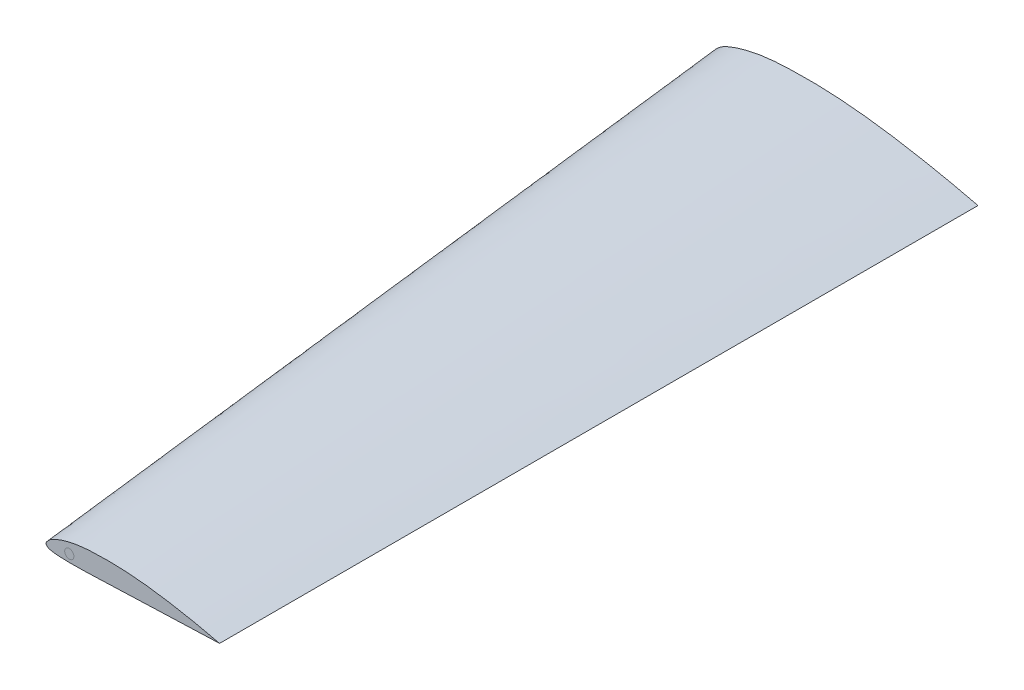
ISO-10303-21;
HEADER;
FILE_DESCRIPTION(('STEP AP214'),'2;1');
FILE_NAME('part.step','',(''),(''),'','','');
FILE_SCHEMA(('AUTOMOTIVE_DESIGN { 1 0 10303 214 1 1 1 1 }'));
ENDSEC;
DATA;
#1=APPLICATION_CONTEXT('core data for automotive mechanical design processes');
#2=APPLICATION_PROTOCOL_DEFINITION('international standard','automotive_design',2000,#1);
#3=PRODUCT_CONTEXT('',#1,'mechanical');
#4=PRODUCT('Part','Part','',(#3));
#5=PRODUCT_RELATED_PRODUCT_CATEGORY('part','',(#4));
#6=PRODUCT_DEFINITION_FORMATION('','',#4);
#7=PRODUCT_DEFINITION_CONTEXT('part definition',#1,'design');
#8=PRODUCT_DEFINITION('design','',#6,#7);
#9=PRODUCT_DEFINITION_SHAPE('','',#8);
#10=(LENGTH_UNIT() NAMED_UNIT(*) SI_UNIT(.MILLI.,.METRE.));
#11=(NAMED_UNIT(*) PLANE_ANGLE_UNIT() SI_UNIT($,.RADIAN.));
#12=(NAMED_UNIT(*) SI_UNIT($,.STERADIAN.) SOLID_ANGLE_UNIT());
#13=UNCERTAINTY_MEASURE_WITH_UNIT(LENGTH_MEASURE(1.E-05),#10,'distance_accuracy_value','');
#14=(GEOMETRIC_REPRESENTATION_CONTEXT(3) GLOBAL_UNCERTAINTY_ASSIGNED_CONTEXT((#13)) GLOBAL_UNIT_ASSIGNED_CONTEXT((#10,
#11,#12)) REPRESENTATION_CONTEXT('',''));
#15=CARTESIAN_POINT('',(0.,0.,0.));
#16=DIRECTION('',(0.,0.,1.));
#17=DIRECTION('',(1.,0.,0.));
#18=AXIS2_PLACEMENT_3D('',#15,#16,#17);
#19=CARTESIAN_POINT('',(10.1,0.999999999999999,0.));
#20=DIRECTION('',(0.,0.,-1.));
#21=DIRECTION('',(-1.,0.,0.));
#22=AXIS2_PLACEMENT_3D('',#19,#20,#21);
#23=PLANE('',#22);
#24=CARTESIAN_POINT('',(10.1,0.999999999999999,0.));
#25=DIRECTION('',(0.,0.,-1.));
#26=DIRECTION('',(-1.,0.,0.));
#27=AXIS2_PLACEMENT_3D('',#24,#25,#26);
#28=CIRCLE('',#27,2.);
#29=CARTESIAN_POINT('',(8.1,0.999999999999999,0.));
#30=VERTEX_POINT('',#29);
#31=EDGE_CURVE('E101',#30,#30,#28,.T.);
#32=ORIENTED_EDGE('',*,*,#31,.T.);
#33=EDGE_LOOP('',(#32));
#34=FACE_BOUND('',#33,.T.);
#35=ADVANCED_FACE('F95',(#34),#23,.T.);
#36=CARTESIAN_POINT('',(49.7,0.999999999999999,329.));
#37=DIRECTION('',(0.,0.,-1.));
#38=DIRECTION('',(-1.,0.,0.));
#39=AXIS2_PLACEMENT_3D('',#36,#37,#38);
#40=PLANE('',#39);
#41=CARTESIAN_POINT('',(49.7,0.999999999999999,329.));
#42=DIRECTION('',(0.,0.,-1.));
#43=DIRECTION('',(-1.,0.,0.));
#44=AXIS2_PLACEMENT_3D('',#41,#42,#43);
#45=CIRCLE('',#44,2.);
#46=CARTESIAN_POINT('',(47.7,0.999999999999999,329.));
#47=VERTEX_POINT('',#46);
#48=EDGE_CURVE('E12',#47,#47,#45,.T.);
#49=ORIENTED_EDGE('',*,*,#48,.F.);
#50=EDGE_LOOP('',(#49));
#51=FACE_BOUND('',#50,.T.);
#52=ADVANCED_FACE('F110',(#51),#40,.F.);
#53=CARTESIAN_POINT('',(8.1,0.999999999999999,0.));
#54=CARTESIAN_POINT('',(47.7,0.999999999999999,329.));
#55=CARTESIAN_POINT('',(8.1,5.,0.));
#56=CARTESIAN_POINT('',(47.7,5.,329.));
#57=CARTESIAN_POINT('',(12.1,5.,0.));
#58=CARTESIAN_POINT('',(51.7,5.,329.));
#59=CARTESIAN_POINT('',(12.1,0.999999999999999,0.));
#60=CARTESIAN_POINT('',(51.7,0.999999999999999,329.));
#61=CARTESIAN_POINT('',(12.1,-3.,0.));
#62=CARTESIAN_POINT('',(51.7,-3.,329.));
#63=CARTESIAN_POINT('',(8.1,-3.,0.));
#64=CARTESIAN_POINT('',(47.7,-3.,329.));
#65=CARTESIAN_POINT('',(8.1,0.999999999999999,0.));
#66=CARTESIAN_POINT('',(47.7,0.999999999999999,329.));
#67=(BOUNDED_SURFACE() B_SPLINE_SURFACE(3,1,((#53,#54),(#55,#56),(#57,#58),(#59,#60),(#61,#62),
(#63,#64),(#65,#66)),.UNSPECIFIED.,.T.,.F.,.F.) B_SPLINE_SURFACE_WITH_KNOTS((4,3,4),(2,2),(0.,
0.5,1.),(0.,1.),.UNSPECIFIED.) GEOMETRIC_REPRESENTATION_ITEM() RATIONAL_B_SPLINE_SURFACE(((1.,
1.),(0.333333333333333,0.333333333333333),(0.333333333333333,0.333333333333333),(1.,1.),
(0.333333333333333,0.333333333333333),(0.333333333333333,0.333333333333333),(1.,1.))) REPRESENTATION_ITEM('') SURFACE());
#68=CARTESIAN_POINT('',(47.7,0.999999999999999,329.));
#69=CARTESIAN_POINT('',(47.2875,0.999999999999999,325.572916666667));
#70=CARTESIAN_POINT('',(46.875,0.999999999999999,322.145833333333));
#71=CARTESIAN_POINT('',(46.05,0.999999999999999,315.291666666667));
#72=CARTESIAN_POINT('',(45.6375,0.999999999999999,311.864583333333));
#73=CARTESIAN_POINT('',(44.8125,0.999999999999999,305.010416666667));
#74=CARTESIAN_POINT('',(44.4,0.999999999999999,301.583333333333));
#75=CARTESIAN_POINT('',(43.575,0.999999999999999,294.729166666667));
#76=CARTESIAN_POINT('',(43.1625,0.999999999999999,291.302083333333));
#77=CARTESIAN_POINT('',(42.3375,0.999999999999999,284.447916666667));
#78=CARTESIAN_POINT('',(41.925,0.999999999999999,281.020833333333));
#79=CARTESIAN_POINT('',(41.1,0.999999999999999,274.166666666667));
#80=CARTESIAN_POINT('',(40.6875,0.999999999999999,270.739583333333));
#81=CARTESIAN_POINT('',(39.8625,0.999999999999999,263.885416666667));
#82=CARTESIAN_POINT('',(39.45,0.999999999999999,260.458333333333));
#83=CARTESIAN_POINT('',(38.625,0.999999999999999,253.604166666667));
#84=CARTESIAN_POINT('',(38.2125,0.999999999999999,250.177083333333));
#85=CARTESIAN_POINT('',(37.3875,0.999999999999999,243.322916666667));
#86=CARTESIAN_POINT('',(36.975,0.999999999999999,239.895833333333));
#87=CARTESIAN_POINT('',(36.15,0.999999999999999,233.041666666667));
#88=CARTESIAN_POINT('',(35.7375,0.999999999999999,229.614583333333));
#89=CARTESIAN_POINT('',(34.9125,0.999999999999999,222.760416666667));
#90=CARTESIAN_POINT('',(34.5,0.999999999999999,219.333333333333));
#91=CARTESIAN_POINT('',(33.675,0.999999999999999,212.479166666667));
#92=CARTESIAN_POINT('',(33.2625,0.999999999999999,209.052083333333));
#93=CARTESIAN_POINT('',(32.4375,0.999999999999999,202.197916666667));
#94=CARTESIAN_POINT('',(32.025,0.999999999999999,198.770833333333));
#95=CARTESIAN_POINT('',(31.2,0.999999999999999,191.916666666667));
#96=CARTESIAN_POINT('',(30.7875,0.999999999999999,188.489583333333));
#97=CARTESIAN_POINT('',(29.9625,0.999999999999999,181.635416666667));
#98=CARTESIAN_POINT('',(29.55,0.999999999999999,178.208333333333));
#99=CARTESIAN_POINT('',(28.725,0.999999999999999,171.354166666667));
#100=CARTESIAN_POINT('',(28.3125,0.999999999999999,167.927083333333));
#101=CARTESIAN_POINT('',(27.4875,0.999999999999999,161.072916666667));
#102=CARTESIAN_POINT('',(27.075,0.999999999999999,157.645833333333));
#103=CARTESIAN_POINT('',(26.25,0.999999999999999,150.791666666667));
#104=CARTESIAN_POINT('',(25.8375,0.999999999999999,147.364583333333));
#105=CARTESIAN_POINT('',(25.0125,0.999999999999999,140.510416666667));
#106=CARTESIAN_POINT('',(24.6,0.999999999999999,137.083333333333));
#107=CARTESIAN_POINT('',(23.775,0.999999999999999,130.229166666667));
#108=CARTESIAN_POINT('',(23.3625,0.999999999999999,126.802083333333));
#109=CARTESIAN_POINT('',(22.5375,0.999999999999999,119.947916666667));
#110=CARTESIAN_POINT('',(22.125,0.999999999999999,116.520833333333));
#111=CARTESIAN_POINT('',(21.3,0.999999999999999,109.666666666667));
#112=CARTESIAN_POINT('',(20.8875,0.999999999999999,106.239583333333));
#113=CARTESIAN_POINT('',(20.0625,0.999999999999999,99.3854166666667));
#114=CARTESIAN_POINT('',(19.65,0.999999999999999,95.9583333333334));
#115=CARTESIAN_POINT('',(18.825,0.999999999999999,89.1041666666667));
#116=CARTESIAN_POINT('',(18.4125,0.999999999999999,85.6770833333333));
#117=CARTESIAN_POINT('',(17.5875,0.999999999999999,78.8229166666667));
#118=CARTESIAN_POINT('',(17.175,0.999999999999999,75.3958333333333));
#119=CARTESIAN_POINT('',(16.35,0.999999999999999,68.5416666666667));
#120=CARTESIAN_POINT('',(15.9375,0.999999999999999,65.1145833333334));
#121=CARTESIAN_POINT('',(15.1125,0.999999999999999,58.2604166666667));
#122=CARTESIAN_POINT('',(14.7,0.999999999999999,54.8333333333333));
#123=CARTESIAN_POINT('',(13.875,0.999999999999999,47.9791666666667));
#124=CARTESIAN_POINT('',(13.4625,0.999999999999999,44.5520833333333));
#125=CARTESIAN_POINT('',(12.6375,0.999999999999999,37.6979166666667));
#126=CARTESIAN_POINT('',(12.225,0.999999999999999,34.2708333333333));
#127=CARTESIAN_POINT('',(11.4,0.999999999999999,27.4166666666667));
#128=CARTESIAN_POINT('',(10.9875,0.999999999999999,23.9895833333333));
#129=CARTESIAN_POINT('',(10.1625,0.999999999999999,17.1354166666667));
#130=CARTESIAN_POINT('',(9.75,0.999999999999999,13.7083333333333));
#131=CARTESIAN_POINT('',(8.925,0.999999999999999,6.85416666666667));
#132=CARTESIAN_POINT('',(8.5125,0.999999999999999,3.42708333333334));
#133=CARTESIAN_POINT('',(8.1,0.999999999999999,0.));
#134=B_SPLINE_CURVE_WITH_KNOTS('',3,(#68,#69,#70,#71,#72,#73,#74,#75,#76,#77,#78,#79,#80,#81,
#82,#83,#84,#85,#86,#87,#88,#89,#90,#91,#92,#93,#94,#95,#96,#97,#98,#99,#100,#101,#102,#103,
#104,#105,#106,#107,#108,#109,#110,#111,#112,#113,#114,#115,#116,#117,#118,#119,#120,#121,#122,
#123,#124,#125,#126,#127,#128,#129,#130,#131,#132,#133),.UNSPECIFIED.,.F.,.F.,(4,2,2,2,2,2,2,2,
2,2,2,2,2,2,2,2,2,2,2,2,2,2,2,2,2,2,2,2,2,2,2,2,4),(0.,10.3554578755601,20.7109157511202,
31.0663736266803,41.4218315022405,51.7772893778006,62.1327472533607,72.4882051289208,
82.8436630044809,93.1991208800411,103.554578755601,113.910036631161,124.265494506721,
134.620952382282,144.976410257842,155.331868133402,165.687326008962,176.042783884522,
186.398241760082,196.753699635642,207.109157511202,217.464615386762,227.820073262323,
238.175531137883,248.530989013443,258.886446889003,269.241904764563,279.597362640123,
289.952820515683,300.308278391243,310.663736266804,321.019194142364,331.374652017924),.UNSPECIFIED.);
#135=EDGE_CURVE('BSEAM108',#47,#30,#134,.T.);
#136=ORIENTED_EDGE('',*,*,#48,.T.);
#137=ORIENTED_EDGE('',*,*,#31,.F.);
#138=ORIENTED_EDGE('',*,*,#135,.T.);
#139=ORIENTED_EDGE('',*,*,#135,.F.);
#140=EDGE_LOOP('',(#136,#138,#137,#139));
#141=FACE_BOUND('',#140,.T.);
#142=ADVANCED_FACE('F108',(#141),#67,.F.);
#143=CLOSED_SHELL('',(#35,#52,#142));
#144=MANIFOLD_SOLID_BREP('B2',#143);
#145=CARTESIAN_POINT('',(114.900829426016,-0.0501642102156497,329.));
#146=DIRECTION('',(0.03670589649599,-0.99932611151837,0.));
#147=DIRECTION('',(-0.99932611151837,-0.03670589649599,0.));
#148=AXIS2_PLACEMENT_3D('',#145,#146,#147);
#149=PLANE('',#148);
#150=DIRECTION('',(-0.99932611151837,-0.03670589649599,0.));
#151=VECTOR('',#150,1.);
#152=CARTESIAN_POINT('',(114.736719522713,-0.056192073447858,329.));
#153=LINE('',#152,#151);
#154=CARTESIAN_POINT('',(114.900829426016,-0.0501642102156497,329.));
#155=VERTEX_POINT('',#154);
#156=CARTESIAN_POINT('',(114.57260961941,-0.0622199366800662,329.));
#157=VERTEX_POINT('',#156);
#158=EDGE_CURVE('E93',#155,#157,#153,.T.);
#159=ORIENTED_EDGE('',*,*,#158,.T.);
#160=DIRECTION('',(-0.00052464922681561,-1.92707065233546E-05,-0.999999862185905));
#161=VECTOR('',#160,1.);
#162=CARTESIAN_POINT('',(114.486304809705,-0.0653899683400331,164.5));
#163=LINE('',#162,#161);
#164=CARTESIAN_POINT('',(114.4,-0.06856,0.));
#165=VERTEX_POINT('',#164);
#166=EDGE_CURVE('E161',#157,#165,#163,.T.);
#167=ORIENTED_EDGE('',*,*,#166,.T.);
#168=DIRECTION('',(-0.99932611151837,-0.0367058964959925,0.));
#169=VECTOR('',#168,1.);
#170=CARTESIAN_POINT('',(114.650414713008,-0.0593621051078248,0.));
#171=LINE('',#170,#169);
#172=CARTESIAN_POINT('',(114.900829426016,-0.0501642102156497,0.));
#173=VERTEX_POINT('',#172);
#174=EDGE_CURVE('E210',#173,#165,#171,.T.);
#175=ORIENTED_EDGE('',*,*,#174,.F.);
#176=DIRECTION('',(0.,0.,-1.));
#177=VECTOR('',#176,1.);
#178=CARTESIAN_POINT('',(114.900829426016,-0.0501642102156497,164.5));
#179=LINE('',#178,#177);
#180=EDGE_CURVE('E191',#155,#173,#179,.T.);
#181=ORIENTED_EDGE('',*,*,#180,.F.);
#182=EDGE_LOOP('',(#159,#167,#175,#181));
#183=FACE_BOUND('',#182,.T.);
#184=ADVANCED_FACE('F149',(#183),#149,.T.);
#185=CARTESIAN_POINT('',(114.57260961941,-0.0622199366800662,329.));
#186=CARTESIAN_POINT('',(114.4,-0.06856,0.));
#187=CARTESIAN_POINT('',(112.977295975491,-0.120816841951953,329.));
#188=CARTESIAN_POINT('',(111.965716629161,-0.157972807713173,0.));
#189=CARTESIAN_POINT('',(109.786644863781,-0.237979796076084,329.));
#190=CARTESIAN_POINT('',(107.097110694278,-0.336751805766281,0.));
#191=CARTESIAN_POINT('',(105.000693099298,-0.413750156151413,329.000000000001));
#192=CARTESIAN_POINT('',(99.7942412380696,-0.604959601121479,0.));
#193=CARTESIAN_POINT('',(100.214728756306,-0.589510986458513,329.));
#194=CARTESIAN_POINT('',(92.4913536383134,-0.8731494297109,0.));
#195=CARTESIAN_POINT('',(96.2264313571632,-0.735983254405373,329.));
#196=CARTESIAN_POINT('',(86.4056226452766,-1.09665710687671,0.));
#197=CARTESIAN_POINT('',(93.0357910844883,-0.85316110543344,329.));
#198=CARTESIAN_POINT('',(81.5370332937189,-1.27545083091915,0.));
#199=CARTESIAN_POINT('',(90.6428111354104,-0.941052950988877,329.));
#200=CARTESIAN_POINT('',(77.885594217603,-1.40956958634636,0.));
#201=CARTESIAN_POINT('',(88.2498328738692,-1.0289616927778,329.));
#202=CARTESIAN_POINT('',(74.2341544850718,-1.5437082159473,0.));
#203=CARTESIAN_POINT('',(85.856852391205,-1.11683664511502,329.));
#204=CARTESIAN_POINT('',(70.5827135432517,-1.67779370490371,0.));
#205=CARTESIAN_POINT('',(83.4638704721177,-1.2046573139067,329.));
#206=CARTESIAN_POINT('',(66.9312695396541,-1.81180573537152,0.));
#207=CARTESIAN_POINT('',(81.0708879975479,-1.29247078457698,329.));
#208=CARTESIAN_POINT('',(63.2798246772732,-1.94578905588669,0.));
#209=CARTESIAN_POINT('',(78.6779074851115,-1.38033351483244,329.));
#210=CARTESIAN_POINT('',(59.6283831410075,-2.07986597687277,0.));
#211=CARTESIAN_POINT('',(76.284934331329,-1.46839890937835,329.));
#212=CARTESIAN_POINT('',(55.9769530860873,-2.21425367726004,0.));
#213=CARTESIAN_POINT('',(73.8919664634316,-1.55660594759836,329.000000000001));
#214=CARTESIAN_POINT('',(52.3255302758724,-2.34883859679651,0.));
#215=CARTESIAN_POINT('',(71.4989899683453,-1.64458072330846,328.999999999999));
#216=CARTESIAN_POINT('',(48.6740949273067,-2.48308328284724,0.));
#217=CARTESIAN_POINT('',(69.105989839964,-1.73190836915481,329.000000000001));
#218=CARTESIAN_POINT('',(45.022623273531,-2.61633760751869,0.));
#219=CARTESIAN_POINT('',(66.7129651493619,-1.81856384168044,328.999999999999));
#220=CARTESIAN_POINT('',(41.3711135439631,-2.74854338410483,0.));
#221=CARTESIAN_POINT('',(64.3199669373025,-1.90594191039954,329.000000000001));
#222=CARTESIAN_POINT('',(37.7196460479609,-2.88191417837728,0.));
#223=CARTESIAN_POINT('',(62.3258668299447,-1.98053661442866,329.));
#224=CARTESIAN_POINT('',(34.6768527696352,-2.99567203272385,0.));
#225=CARTESIAN_POINT('',(60.7306395653596,-2.04158861078398,329.));
#226=CARTESIAN_POINT('',(32.2427036249245,-3.08892865656621,0.));
#227=CARTESIAN_POINT('',(59.5341984389728,-2.0868333620039,329.));
#228=CARTESIAN_POINT('',(30.4170537095853,-3.15787478213016,0.));
#229=CARTESIAN_POINT('',(58.3376895460393,-2.13030150456465,329.));
#230=CARTESIAN_POINT('',(28.5913075746204,-3.22423675912527,0.));
#231=CARTESIAN_POINT('',(57.1410810890218,-2.17088745999478,329.));
#232=CARTESIAN_POINT('',(26.7654048989622,-3.2861862573127,0.));
#233=CARTESIAN_POINT('',(55.9443412703829,-2.20748564982281,329.));
#234=CARTESIAN_POINT('',(24.9393037637721,-3.3420032780021,0.));
#235=CARTESIAN_POINT('',(54.7474529311727,-2.23888966087624,329.));
#236=CARTESIAN_POINT('',(23.1129754350255,-3.38993650770668,0.));
#237=CARTESIAN_POINT('',(53.5504153162138,-2.26397201099151,329.));
#238=CARTESIAN_POINT('',(21.2864190315302,-3.42820995119329,0.));
#239=CARTESIAN_POINT('',(52.353232928687,-2.28124339291768,328.999999999999));
#240=CARTESIAN_POINT('',(19.4596429108321,-3.4545494980358,0.));
#241=CARTESIAN_POINT('',(51.15595355233,-2.288861920351,329.000000000001));
#242=CARTESIAN_POINT('',(17.6327163554305,-3.46619351578578,0.));
#243=CARTESIAN_POINT('',(49.9586406141466,-2.28571853254573,329.));
#244=CARTESIAN_POINT('',(15.8057424311789,-3.46135030596471,0.));
#245=CARTESIAN_POINT('',(48.7614456222737,-2.26913668236569,328.999999999999));
#246=CARTESIAN_POINT('',(13.9789412855685,-3.43617298193985,0.));
#247=CARTESIAN_POINT('',(47.5644880850567,-2.23954580418405,329.000000000001));
#248=CARTESIAN_POINT('',(12.1525159866253,-3.39081697985119,0.));
#249=CARTESIAN_POINT('',(46.3681294391765,-2.19096327836138,328.999999999999));
#250=CARTESIAN_POINT('',(10.3269829850202,-3.31692842661875,0.));
#251=CARTESIAN_POINT('',(45.1723870805993,-2.13077185247814,329.000000000001));
#252=CARTESIAN_POINT('',(8.50241829521622,-3.22500915813475,0.));
#253=CARTESIAN_POINT('',(44.1766473883666,-2.06485136570954,328.999999999999));
#254=CARTESIAN_POINT('',(6.98300428865084,-3.12433212750466,0.));
#255=CARTESIAN_POINT('',(43.3830893437349,-1.97750102636705,329.000000000001));
#256=CARTESIAN_POINT('',(5.77213418222719,-2.99109577573727,0.));
#257=CARTESIAN_POINT('',(42.7903884171788,-1.89255413261195,328.999999999999));
#258=CARTESIAN_POINT('',(4.86771256745936,-2.86147635484054,0.));
#259=CARTESIAN_POINT('',(42.2018621119385,-1.78259761794642,329.000000000001));
#260=CARTESIAN_POINT('',(3.96972156813326,-2.69356724495905,0.));
#261=CARTESIAN_POINT('',(41.6144368512239,-1.66711733291326,328.999999999999));
#262=CARTESIAN_POINT('',(3.07329938019767,-2.5176539368822,0.));
#263=CARTESIAN_POINT('',(41.030721908302,-1.53296410466494,329.000000000001));
#264=CARTESIAN_POINT('',(2.18268391666198,-2.3127837560272,0.));
#265=CARTESIAN_POINT('',(40.5658570608416,-1.34296250191487,328.999999999999));
#266=CARTESIAN_POINT('',(1.47329929331152,-2.02281116106069,0.));
#267=CARTESIAN_POINT('',(40.2328838259331,-1.12111197664618,329.));
#268=CARTESIAN_POINT('',(0.965300946177489,-1.68427874419331,0.));
#269=CARTESIAN_POINT('',(40.0045523416234,-0.926760940944612,329.));
#270=CARTESIAN_POINT('',(0.616853662639164,-1.38773413128347,0.));
#271=CARTESIAN_POINT('',(39.8058884927858,-0.701609182245043,329.));
#272=CARTESIAN_POINT('',(0.313781760209367,-1.04410645837054,0.));
#273=CARTESIAN_POINT('',(39.6506080929225,-0.443706027629307,329.));
#274=CARTESIAN_POINT('',(0.0769541024066916,-0.650538017604325,0.));
#275=CARTESIAN_POINT('',(39.5764905355394,-0.148134503442184,329.));
#276=CARTESIAN_POINT('',(-0.0364245156961572,-0.199715317390292,0.));
#277=CARTESIAN_POINT('',(39.6212379263324,0.152906641389699,329.));
#278=CARTESIAN_POINT('',(0.0320651688817571,0.259740207343021,0.));
#279=CARTESIAN_POINT('',(39.7462731745835,0.426434812966566,329.));
#280=CARTESIAN_POINT('',(0.222717607662432,0.677061995084372,0.));
#281=CARTESIAN_POINT('',(39.9118284437912,0.676489937329452,329.));
#282=CARTESIAN_POINT('',(0.475409900417133,1.05859895915268,0.));
#283=CARTESIAN_POINT('',(40.1020297991035,0.907946183502351,329.));
#284=CARTESIAN_POINT('',(0.765550841982641,1.41183330248373,0.));
#285=CARTESIAN_POINT('',(40.3058904903587,1.12719115072782,329.));
#286=CARTESIAN_POINT('',(1.07673483260303,1.74628416301866,0.));
#287=CARTESIAN_POINT('',(40.5170780992003,1.33935694664796,329.));
#288=CARTESIAN_POINT('',(1.39880128657276,2.07019260086103,0.));
#289=CARTESIAN_POINT('',(40.7305626383487,1.54914088404984,329.));
#290=CARTESIAN_POINT('',(1.72484435432684,2.39003706317112,0.));
#291=CARTESIAN_POINT('',(40.9491748450726,1.75369770525246,329.));
#292=CARTESIAN_POINT('',(2.05806352461083,2.70249872806248,0.));
#293=CARTESIAN_POINT('',(41.2491898335489,2.01693149821586,329.));
#294=CARTESIAN_POINT('',(2.51618795565956,3.10386363754482,0.));
#295=CARTESIAN_POINT('',(41.6433845733717,2.32338414751801,329.));
#296=CARTESIAN_POINT('',(3.11744388388253,3.57170414689077,0.));
#297=CARTESIAN_POINT('',(42.1419159584038,2.65541038243405,329.));
#298=CARTESIAN_POINT('',(3.87827233736804,4.07822471273745,0.));
#299=CARTESIAN_POINT('',(42.6603325762503,2.95527445622198,329.));
#300=CARTESIAN_POINT('',(4.66927623600314,4.53582075141618,0.));
#301=CARTESIAN_POINT('',(43.1920051006209,3.23067304723329,329.));
#302=CARTESIAN_POINT('',(5.48057328365004,4.95603831197717,0.));
#303=CARTESIAN_POINT('',(43.73461712113,3.48384959688034,329.000000000001));
#304=CARTESIAN_POINT('',(6.30853823898846,5.34236268864598,0.));
#305=CARTESIAN_POINT('',(44.2853103695626,3.71876278425974,328.999999999999));
#306=CARTESIAN_POINT('',(7.14883728112551,5.70082045708303,0.));
#307=CARTESIAN_POINT('',(44.842102539349,3.93881445027894,329.));
#308=CARTESIAN_POINT('',(7.99844900100825,6.03659176034702,0.));
#309=CARTESIAN_POINT('',(45.4037436656897,4.14611278204335,329.));
#310=CARTESIAN_POINT('',(8.85544440881743,6.3529290932593,0.));
#311=CARTESIAN_POINT('',(45.9688602827349,4.34370744577013,329.));
#312=CARTESIAN_POINT('',(9.71777798239826,6.65438937250343,0.));
#313=CARTESIAN_POINT('',(46.5371284585512,4.53207887325267,329.));
#314=CARTESIAN_POINT('',(10.5848518324099,6.94191487900306,0.));
#315=CARTESIAN_POINT('',(47.2989015018565,4.77055534918493,329.));
#316=CARTESIAN_POINT('',(11.7472766809127,7.30570333780045,0.));
#317=CARTESIAN_POINT('',(48.2585469423734,5.04413868204417,329.));
#318=CARTESIAN_POINT('',(13.2115681037735,7.72323418873163,0.));
#319=CARTESIAN_POINT('',(49.4194455039909,5.33759135782374,329.));
#320=CARTESIAN_POINT('',(14.9829959141197,8.17097094627978,0.));
#321=CARTESIAN_POINT('',(50.5876889588109,5.60017543141388,329.));
#322=CARTESIAN_POINT('',(16.7656063461902,8.57166989486869,0.));
#323=CARTESIAN_POINT('',(51.7618910786936,5.83463957492898,329.));
#324=CARTESIAN_POINT('',(18.5573221255501,8.92942802521701,0.));
#325=CARTESIAN_POINT('',(52.9413793027427,6.04087523248973,329.));
#326=CARTESIAN_POINT('',(20.357097215315,9.24412694329611,0.));
#327=CARTESIAN_POINT('',(54.1256039736483,6.21798437376885,328.999999999999));
#328=CARTESIAN_POINT('',(22.1641029633317,9.51437922323504,0.));
#329=CARTESIAN_POINT('',(55.7101440829799,6.41328251131465,329.000000000001));
#330=CARTESIAN_POINT('',(24.581947434041,9.81237724369643,0.));
#331=CARTESIAN_POINT('',(57.6983353941993,6.58884014267491,328.999999999999));
#332=CARTESIAN_POINT('',(27.6157220253602,10.0802867880787,0.));
#333=CARTESIAN_POINT('',(60.089648548173,6.7178868839627,329.));
#334=CARTESIAN_POINT('',(31.2646245807487,10.2771026229954,0.));
#335=CARTESIAN_POINT('',(62.4830008435416,6.79713214430168,329.));
#336=CARTESIAN_POINT('',(34.9166302660792,10.3980954427901,0.));
#337=CARTESIAN_POINT('',(64.8771108097576,6.8473589228501,329.));
#338=CARTESIAN_POINT('',(38.5697944561475,10.4747486999319,0.));
#339=CARTESIAN_POINT('',(67.2717857562776,6.85811026179045,329.));
#340=CARTESIAN_POINT('',(42.2238222521298,10.4911444745235,0.));
#341=CARTESIAN_POINT('',(69.6662566295519,6.82456608957842,329.));
#342=CARTESIAN_POINT('',(45.8775382661358,10.4399604287515,0.));
#343=CARTESIAN_POINT('',(72.0595159941657,6.74076018787565,329.));
#344=CARTESIAN_POINT('',(49.5294044274174,10.3120908518743,0.));
#345=CARTESIAN_POINT('',(74.4507854867059,6.61312441778202,329.));
#346=CARTESIAN_POINT('',(53.178236653511,10.1173287938002,0.));
#347=CARTESIAN_POINT('',(76.83962110388,6.44606051592298,329.));
#348=CARTESIAN_POINT('',(56.8233498066736,9.86239123421157,0.));
#349=CARTESIAN_POINT('',(79.2257994806511,6.24485556975728,329.));
#350=CARTESIAN_POINT('',(60.4644197278447,9.55540656456613,0.));
#351=CARTESIAN_POINT('',(81.608883892125,6.00968462430416,329.));
#352=CARTESIAN_POINT('',(64.1007467162242,9.19649996426467,0.));
#353=CARTESIAN_POINT('',(83.9884067169117,5.74098583428185,329.));
#354=CARTESIAN_POINT('',(67.7316796667099,8.78660201096427,0.));
#355=CARTESIAN_POINT('',(86.3639430060132,5.43895442797606,329.));
#356=CARTESIAN_POINT('',(71.35645846618,8.32555431852534,0.));
#357=CARTESIAN_POINT('',(88.7353798020637,5.10654326179853,329.));
#358=CARTESIAN_POINT('',(74.9750949806674,7.81858317834956,0.));
#359=CARTESIAN_POINT('',(91.1029623317014,4.74754064005611,329.));
#360=CARTESIAN_POINT('',(78.587697519638,7.27053006377924,0.));
#361=CARTESIAN_POINT('',(93.4669358215645,4.36573486705565,329.));
#362=CARTESIAN_POINT('',(82.1949389593251,6.68807069894766,0.));
#363=CARTESIAN_POINT('',(96.6140720283502,3.82758553402491,329.));
#364=CARTESIAN_POINT('',(86.9971156579425,5.86690602257278,0.));
#365=CARTESIAN_POINT('',(100.5389082124,3.10287561201863,329.));
#366=CARTESIAN_POINT('',(92.98602152733,4.761034593382,0.));
#367=CARTESIAN_POINT('',(105.23248636945,2.15016018644571,329.));
#368=CARTESIAN_POINT('',(100.147932525585,3.30731157548085,0.));
#369=CARTESIAN_POINT('',(109.912024284167,1.13032636467303,329.));
#370=CARTESIAN_POINT('',(107.288427475213,1.75113882040688,0.));
#371=CARTESIAN_POINT('',(113.019270648536,0.395869046271625,329.));
#372=CARTESIAN_POINT('',(112.029765632302,0.630436336958154,0.));
#373=CARTESIAN_POINT('',(114.600066449668,0.0211332115694607,329.));
#374=CARTESIAN_POINT('',(114.441896278871,0.0586282700306697,0.));
#375=CARTESIAN_POINT('',(114.654664571062,0.00819044402219781,329.));
#376=CARTESIAN_POINT('',(114.525207356504,0.03887894744609,0.));
#377=CARTESIAN_POINT('',(114.736719522714,-0.0112611073904201,329.));
#378=CARTESIAN_POINT('',(114.650414713008,0.00919789489218184,0.));
#379=CARTESIAN_POINT('',(114.818774474365,-0.0307126588030327,329.));
#380=CARTESIAN_POINT('',(114.775622069512,-0.0204831576617346,0.));
#381=CARTESIAN_POINT('',(114.873477775466,-0.0436803597447778,329.));
#382=CARTESIAN_POINT('',(114.859093640515,-0.0402705260310117,0.));
#383=CARTESIAN_POINT('',(114.900829426016,-0.0501642102156497,329.));
#384=CARTESIAN_POINT('',(114.900829426016,-0.0501642102156497,0.));
#385=B_SPLINE_SURFACE_WITH_KNOTS('',3,1,((#185,#186),(#187,#188),(#189,#190),(#191,#192),(#193,
#194),(#195,#196),(#197,#198),(#199,#200),(#201,#202),(#203,#204),(#205,#206),(#207,#208),(#209,
#210),(#211,#212),(#213,#214),(#215,#216),(#217,#218),(#219,#220),(#221,#222),(#223,#224),(#225,
#226),(#227,#228),(#229,#230),(#231,#232),(#233,#234),(#235,#236),(#237,#238),(#239,#240),(#241,
#242),(#243,#244),(#245,#246),(#247,#248),(#249,#250),(#251,#252),(#253,#254),(#255,#256),(#257,
#258),(#259,#260),(#261,#262),(#263,#264),(#265,#266),(#267,#268),(#269,#270),(#271,#272),(#273,
#274),(#275,#276),(#277,#278),(#279,#280),(#281,#282),(#283,#284),(#285,#286),(#287,#288),(#289,
#290),(#291,#292),(#293,#294),(#295,#296),(#297,#298),(#299,#300),(#301,#302),(#303,#304),(#305,
#306),(#307,#308),(#309,#310),(#311,#312),(#313,#314),(#315,#316),(#317,#318),(#319,#320),(#321,
#322),(#323,#324),(#325,#326),(#327,#328),(#329,#330),(#331,#332),(#333,#334),(#335,#336),(#337,
#338),(#339,#340),(#341,#342),(#343,#344),(#345,#346),(#347,#348),(#349,#350),(#351,#352),(#353,
#354),(#355,#356),(#357,#358),(#359,#360),(#361,#362),(#363,#364),(#365,#366),(#367,#368),(#369,
#370),(#371,#372),(#373,#374),(#375,#376),(#377,#378),(#379,#380),(#381,#382),(#383,#384)),
.UNSPECIFIED.,.F.,.F.,.F.,(4,1,1,1,1,1,1,1,1,1,1,1,1,1,1,1,1,1,1,1,1,1,1,1,1,1,1,1,1,1,1,1,1,1,
1,1,1,1,1,1,1,1,1,1,1,1,1,1,1,1,1,1,1,1,1,1,1,1,1,1,1,1,1,1,1,1,1,1,1,1,1,1,1,1,1,1,1,1,1,1,1,1,
1,1,1,1,1,1,1,1,1,1,2,1,1,1,4),(2,2),(0.,0.0311811053211745,0.0623622106423489,
0.0935433159635234,0.124724421284698,0.140314973945285,0.155905526605872,0.17149607926646,
0.187086631927047,0.202677184587634,0.218267737248221,0.233858289908809,0.249448842569396,
0.265039395229983,0.28062994789057,0.296220500551158,0.311811053211745,0.327401605872332,
0.342992158532919,0.350787434863213,0.358582711193506,0.3663779875238,0.374173263854094,
0.381968540184387,0.389763816514681,0.397559092844974,0.405354369175268,0.413149645505562,
0.420944921835855,0.428740198166149,0.436535474496443,0.444330750826736,0.45212602715703,
0.459921303487323,0.46381894165247,0.467716579817617,0.471614217982764,0.475511856147911,
0.479409494313058,0.483307132478204,0.485255951560778,0.487204770643351,0.489153589725925,
0.491102408808498,0.493051227891071,0.495000046973645,0.496948866056218,0.498897685138791,
0.500846504221365,0.502795323303939,0.504744142386512,0.506692961469085,0.508641780551659,
0.510590599634232,0.514488237799379,0.518385875964525,0.522283514129673,0.526181152294819,
0.530078790459966,0.533976428625113,0.53787406679026,0.541771704955407,0.545669343120553,
0.5495669812857,0.553464619450847,0.561259895781141,0.569055172111434,0.576850448441728,
0.584645724772021,0.592441001102315,0.600236277432609,0.608031553762902,0.62362210642349,
0.639212659084077,0.654803211744664,0.670393764405251,0.685984317065839,0.701574869726425,
0.717165422387013,0.7327559750476,0.748346527708187,0.763937080368774,0.779527633029362,
0.795118185689949,0.810708738350536,0.826299291011123,0.841889843671711,0.857480396332298,
0.873070948992885,0.90425205431406,0.935433159635234,0.966614264956409,0.997795370277583,
0.998346527708187,0.998897685138791,0.999448842569396,1.),(0.,1.),.UNSPECIFIED.);
#386=CARTESIAN_POINT('',(114.57260961941,-0.0622199366800662,329.));
#387=CARTESIAN_POINT('',(112.977295975491,-0.120816841951953,329.));
#388=CARTESIAN_POINT('',(109.786644863781,-0.237979796076084,329.));
#389=CARTESIAN_POINT('',(105.000693099298,-0.413750156151413,329.000000000001));
#390=CARTESIAN_POINT('',(100.214728756306,-0.589510986458513,329.));
#391=CARTESIAN_POINT('',(96.2264313571632,-0.735983254405373,329.));
#392=CARTESIAN_POINT('',(93.0357910844883,-0.85316110543344,329.));
#393=CARTESIAN_POINT('',(90.6428111354104,-0.941052950988877,329.));
#394=CARTESIAN_POINT('',(88.2498328738692,-1.0289616927778,329.));
#395=CARTESIAN_POINT('',(85.856852391205,-1.11683664511502,329.));
#396=CARTESIAN_POINT('',(83.4638704721177,-1.2046573139067,329.));
#397=CARTESIAN_POINT('',(81.0708879975479,-1.29247078457698,329.));
#398=CARTESIAN_POINT('',(78.6779074851115,-1.38033351483244,329.));
#399=CARTESIAN_POINT('',(76.284934331329,-1.46839890937835,329.));
#400=CARTESIAN_POINT('',(73.8919664634316,-1.55660594759836,329.000000000001));
#401=CARTESIAN_POINT('',(71.4989899683453,-1.64458072330846,328.999999999999));
#402=CARTESIAN_POINT('',(69.105989839964,-1.73190836915481,329.000000000001));
#403=CARTESIAN_POINT('',(66.7129651493619,-1.81856384168044,328.999999999999));
#404=CARTESIAN_POINT('',(64.3199669373025,-1.90594191039954,329.000000000001));
#405=CARTESIAN_POINT('',(62.3258668299447,-1.98053661442866,329.));
#406=CARTESIAN_POINT('',(60.7306395653596,-2.04158861078398,329.));
#407=CARTESIAN_POINT('',(59.5341984389728,-2.0868333620039,329.));
#408=CARTESIAN_POINT('',(58.3376895460393,-2.13030150456465,329.));
#409=CARTESIAN_POINT('',(57.1410810890218,-2.17088745999478,329.));
#410=CARTESIAN_POINT('',(55.9443412703829,-2.20748564982281,329.));
#411=CARTESIAN_POINT('',(54.7474529311727,-2.23888966087624,329.));
#412=CARTESIAN_POINT('',(53.5504153162138,-2.26397201099151,329.));
#413=CARTESIAN_POINT('',(52.353232928687,-2.28124339291768,328.999999999999));
#414=CARTESIAN_POINT('',(51.15595355233,-2.288861920351,329.000000000001));
#415=CARTESIAN_POINT('',(49.9586406141466,-2.28571853254573,329.));
#416=CARTESIAN_POINT('',(48.7614456222737,-2.26913668236569,328.999999999999));
#417=CARTESIAN_POINT('',(47.5644880850567,-2.23954580418405,329.000000000001));
#418=CARTESIAN_POINT('',(46.3681294391765,-2.19096327836138,328.999999999999));
#419=CARTESIAN_POINT('',(45.1723870805993,-2.13077185247814,329.000000000001));
#420=CARTESIAN_POINT('',(44.1766473883666,-2.06485136570954,328.999999999999));
#421=CARTESIAN_POINT('',(43.3830893437349,-1.97750102636705,329.000000000001));
#422=CARTESIAN_POINT('',(42.7903884171788,-1.89255413261195,328.999999999999));
#423=CARTESIAN_POINT('',(42.2018621119385,-1.78259761794642,329.000000000001));
#424=CARTESIAN_POINT('',(41.6144368512239,-1.66711733291326,328.999999999999));
#425=CARTESIAN_POINT('',(41.030721908302,-1.53296410466494,329.000000000001));
#426=CARTESIAN_POINT('',(40.5658570608416,-1.34296250191487,328.999999999999));
#427=CARTESIAN_POINT('',(40.2328838259331,-1.12111197664618,329.));
#428=CARTESIAN_POINT('',(40.0045523416234,-0.926760940944612,329.));
#429=CARTESIAN_POINT('',(39.8058884927858,-0.701609182245043,329.));
#430=CARTESIAN_POINT('',(39.6506080929225,-0.443706027629307,329.));
#431=CARTESIAN_POINT('',(39.5764905355394,-0.148134503442184,329.));
#432=CARTESIAN_POINT('',(39.6212379263324,0.152906641389699,329.));
#433=CARTESIAN_POINT('',(39.7462731745835,0.426434812966566,329.));
#434=CARTESIAN_POINT('',(39.9118284437912,0.676489937329452,329.));
#435=CARTESIAN_POINT('',(40.1020297991035,0.907946183502351,329.));
#436=CARTESIAN_POINT('',(40.3058904903587,1.12719115072782,329.));
#437=CARTESIAN_POINT('',(40.5170780992003,1.33935694664796,329.));
#438=CARTESIAN_POINT('',(40.7305626383487,1.54914088404984,329.));
#439=CARTESIAN_POINT('',(40.9491748450726,1.75369770525246,329.));
#440=CARTESIAN_POINT('',(41.2491898335489,2.01693149821586,329.));
#441=CARTESIAN_POINT('',(41.6433845733717,2.32338414751801,329.));
#442=CARTESIAN_POINT('',(42.1419159584038,2.65541038243405,329.));
#443=CARTESIAN_POINT('',(42.6603325762503,2.95527445622198,329.));
#444=CARTESIAN_POINT('',(43.1920051006209,3.23067304723329,329.));
#445=CARTESIAN_POINT('',(43.73461712113,3.48384959688034,329.000000000001));
#446=CARTESIAN_POINT('',(44.2853103695626,3.71876278425974,328.999999999999));
#447=CARTESIAN_POINT('',(44.842102539349,3.93881445027894,329.));
#448=CARTESIAN_POINT('',(45.4037436656897,4.14611278204335,329.));
#449=CARTESIAN_POINT('',(45.9688602827349,4.34370744577013,329.));
#450=CARTESIAN_POINT('',(46.5371284585512,4.53207887325267,329.));
#451=CARTESIAN_POINT('',(47.2989015018565,4.77055534918493,329.));
#452=CARTESIAN_POINT('',(48.2585469423734,5.04413868204417,329.));
#453=CARTESIAN_POINT('',(49.4194455039909,5.33759135782374,329.));
#454=CARTESIAN_POINT('',(50.5876889588109,5.60017543141388,329.));
#455=CARTESIAN_POINT('',(51.7618910786936,5.83463957492898,329.));
#456=CARTESIAN_POINT('',(52.9413793027427,6.04087523248973,329.));
#457=CARTESIAN_POINT('',(54.1256039736483,6.21798437376885,328.999999999999));
#458=CARTESIAN_POINT('',(55.7101440829799,6.41328251131465,329.000000000001));
#459=CARTESIAN_POINT('',(57.6983353941993,6.58884014267491,328.999999999999));
#460=CARTESIAN_POINT('',(60.089648548173,6.7178868839627,329.));
#461=CARTESIAN_POINT('',(62.4830008435416,6.79713214430168,329.));
#462=CARTESIAN_POINT('',(64.8771108097576,6.8473589228501,329.));
#463=CARTESIAN_POINT('',(67.2717857562776,6.85811026179045,329.));
#464=CARTESIAN_POINT('',(69.6662566295519,6.82456608957842,329.));
#465=CARTESIAN_POINT('',(72.0595159941657,6.74076018787565,329.));
#466=CARTESIAN_POINT('',(74.4507854867059,6.61312441778202,329.));
#467=CARTESIAN_POINT('',(76.83962110388,6.44606051592298,329.));
#468=CARTESIAN_POINT('',(79.2257994806511,6.24485556975728,329.));
#469=CARTESIAN_POINT('',(81.608883892125,6.00968462430416,329.));
#470=CARTESIAN_POINT('',(83.9884067169117,5.74098583428185,329.));
#471=CARTESIAN_POINT('',(86.3639430060132,5.43895442797606,329.));
#472=CARTESIAN_POINT('',(88.7353798020637,5.10654326179853,329.));
#473=CARTESIAN_POINT('',(91.1029623317014,4.74754064005611,329.));
#474=CARTESIAN_POINT('',(93.4669358215645,4.36573486705565,329.));
#475=CARTESIAN_POINT('',(96.6140720283502,3.82758553402491,329.));
#476=CARTESIAN_POINT('',(100.5389082124,3.10287561201863,329.));
#477=CARTESIAN_POINT('',(105.23248636945,2.15016018644571,329.));
#478=CARTESIAN_POINT('',(109.912024284167,1.13032636467303,329.));
#479=CARTESIAN_POINT('',(113.019270648536,0.395869046271625,329.));
#480=CARTESIAN_POINT('',(114.600066449668,0.0211332115694607,329.));
#481=CARTESIAN_POINT('',(114.654664571062,0.00819044402219781,329.));
#482=CARTESIAN_POINT('',(114.736719522714,-0.0112611073904201,329.));
#483=CARTESIAN_POINT('',(114.818774474365,-0.0307126588030327,329.));
#484=CARTESIAN_POINT('',(114.873477775466,-0.0436803597447778,329.));
#485=CARTESIAN_POINT('',(114.900829426016,-0.0501642102156497,329.));
#486=B_SPLINE_CURVE_WITH_KNOTS('',3,(#386,#387,#388,#389,#390,#391,#392,#393,#394,#395,#396,
#397,#398,#399,#400,#401,#402,#403,#404,#405,#406,#407,#408,#409,#410,#411,#412,#413,#414,#415,
#416,#417,#418,#419,#420,#421,#422,#423,#424,#425,#426,#427,#428,#429,#430,#431,#432,#433,#434,
#435,#436,#437,#438,#439,#440,#441,#442,#443,#444,#445,#446,#447,#448,#449,#450,#451,#452,#453,
#454,#455,#456,#457,#458,#459,#460,#461,#462,#463,#464,#465,#466,#467,#468,#469,#470,#471,#472,
#473,#474,#475,#476,#477,#478,#479,#480,#481,#482,#483,#484,#485),.UNSPECIFIED.,.F.,.F.,(4,1,1,
1,1,1,1,1,1,1,1,1,1,1,1,1,1,1,1,1,1,1,1,1,1,1,1,1,1,1,1,1,1,1,1,1,1,1,1,1,1,1,1,1,1,1,1,1,1,1,1,
1,1,1,1,1,1,1,1,1,1,1,1,1,1,1,1,1,1,1,1,1,1,1,1,1,1,1,1,1,1,1,1,1,1,1,1,1,1,1,1,1,2,1,1,1,4),
(0.,0.0311811053211745,0.0623622106423489,0.0935433159635234,0.124724421284698,
0.140314973945285,0.155905526605872,0.17149607926646,0.187086631927047,0.202677184587634,
0.218267737248221,0.233858289908809,0.249448842569396,0.265039395229983,0.28062994789057,
0.296220500551158,0.311811053211745,0.327401605872332,0.342992158532919,0.350787434863213,
0.358582711193506,0.3663779875238,0.374173263854094,0.381968540184387,0.389763816514681,
0.397559092844974,0.405354369175268,0.413149645505562,0.420944921835855,0.428740198166149,
0.436535474496443,0.444330750826736,0.45212602715703,0.459921303487323,0.46381894165247,
0.467716579817617,0.471614217982764,0.475511856147911,0.479409494313058,0.483307132478204,
0.485255951560778,0.487204770643351,0.489153589725925,0.491102408808498,0.493051227891071,
0.495000046973645,0.496948866056218,0.498897685138791,0.500846504221365,0.502795323303939,
0.504744142386512,0.506692961469085,0.508641780551659,0.510590599634232,0.514488237799379,
0.518385875964525,0.522283514129673,0.526181152294819,0.530078790459966,0.533976428625113,
0.53787406679026,0.541771704955407,0.545669343120553,0.5495669812857,0.553464619450847,
0.561259895781141,0.569055172111434,0.576850448441728,0.584645724772021,0.592441001102315,
0.600236277432609,0.608031553762902,0.62362210642349,0.639212659084077,0.654803211744664,
0.670393764405251,0.685984317065839,0.701574869726425,0.717165422387013,0.7327559750476,
0.748346527708187,0.763937080368774,0.779527633029362,0.795118185689949,0.810708738350536,
0.826299291011123,0.841889843671711,0.857480396332298,0.873070948992885,0.90425205431406,
0.935433159635234,0.966614264956409,0.997795370277583,0.998346527708187,0.998897685138791,
0.999448842569396,1.),.UNSPECIFIED.);
#487=CARTESIAN_POINT('',(114.572609618683,0.027641995607248,329.));
#488=VERTEX_POINT('',#487);
#489=EDGE_CURVE('E194',#157,#488,#486,.T.);
#490=DIRECTION('',(0.97303377141832,-0.230662696766167,0.));
#491=VECTOR('',#490,1.);
#492=CARTESIAN_POINT('',(114.57260961941,0.0276419954348088,329.));
#493=LINE('',#492,#491);
#494=EDGE_CURVE('E178',#488,#155,#493,.T.);
#495=DIRECTION('',(0.973033771418316,-0.230662696766182,0.));
#496=VECTOR('',#495,1.);
#497=CARTESIAN_POINT('',(114.4,0.06856,0.));
#498=LINE('',#497,#496);
#499=CARTESIAN_POINT('',(114.39999999889,0.0685600002631364,0.));
#500=VERTEX_POINT('',#499);
#501=EDGE_CURVE('E169',#500,#173,#498,.T.);
#502=CARTESIAN_POINT('',(114.4,-0.06856,0.));
#503=CARTESIAN_POINT('',(111.965716629161,-0.157972807713173,0.));
#504=CARTESIAN_POINT('',(107.097110694278,-0.336751805766281,0.));
#505=CARTESIAN_POINT('',(99.7942412380696,-0.604959601121479,0.));
#506=CARTESIAN_POINT('',(92.4913536383134,-0.8731494297109,0.));
#507=CARTESIAN_POINT('',(86.4056226452766,-1.09665710687671,0.));
#508=CARTESIAN_POINT('',(81.5370332937189,-1.27545083091915,0.));
#509=CARTESIAN_POINT('',(77.885594217603,-1.40956958634636,0.));
#510=CARTESIAN_POINT('',(74.2341544850718,-1.5437082159473,0.));
#511=CARTESIAN_POINT('',(70.5827135432517,-1.67779370490371,0.));
#512=CARTESIAN_POINT('',(66.9312695396541,-1.81180573537152,0.));
#513=CARTESIAN_POINT('',(63.2798246772732,-1.94578905588669,0.));
#514=CARTESIAN_POINT('',(59.6283831410075,-2.07986597687277,0.));
#515=CARTESIAN_POINT('',(55.9769530860873,-2.21425367726004,0.));
#516=CARTESIAN_POINT('',(52.3255302758724,-2.34883859679651,0.));
#517=CARTESIAN_POINT('',(48.6740949273067,-2.48308328284724,0.));
#518=CARTESIAN_POINT('',(45.022623273531,-2.61633760751869,0.));
#519=CARTESIAN_POINT('',(41.3711135439631,-2.74854338410483,0.));
#520=CARTESIAN_POINT('',(37.7196460479609,-2.88191417837728,0.));
#521=CARTESIAN_POINT('',(34.6768527696352,-2.99567203272385,0.));
#522=CARTESIAN_POINT('',(32.2427036249245,-3.08892865656621,0.));
#523=CARTESIAN_POINT('',(30.4170537095853,-3.15787478213016,0.));
#524=CARTESIAN_POINT('',(28.5913075746204,-3.22423675912527,0.));
#525=CARTESIAN_POINT('',(26.7654048989622,-3.2861862573127,0.));
#526=CARTESIAN_POINT('',(24.9393037637721,-3.3420032780021,0.));
#527=CARTESIAN_POINT('',(23.1129754350255,-3.38993650770668,0.));
#528=CARTESIAN_POINT('',(21.2864190315302,-3.42820995119329,0.));
#529=CARTESIAN_POINT('',(19.4596429108321,-3.4545494980358,0.));
#530=CARTESIAN_POINT('',(17.6327163554305,-3.46619351578578,0.));
#531=CARTESIAN_POINT('',(15.8057424311789,-3.46135030596471,0.));
#532=CARTESIAN_POINT('',(13.9789412855685,-3.43617298193985,0.));
#533=CARTESIAN_POINT('',(12.1525159866253,-3.39081697985119,0.));
#534=CARTESIAN_POINT('',(10.3269829850202,-3.31692842661875,0.));
#535=CARTESIAN_POINT('',(8.50241829521622,-3.22500915813475,0.));
#536=CARTESIAN_POINT('',(6.98300428865084,-3.12433212750466,0.));
#537=CARTESIAN_POINT('',(5.77213418222719,-2.99109577573727,0.));
#538=CARTESIAN_POINT('',(4.86771256745936,-2.86147635484054,0.));
#539=CARTESIAN_POINT('',(3.96972156813326,-2.69356724495905,0.));
#540=CARTESIAN_POINT('',(3.07329938019767,-2.5176539368822,0.));
#541=CARTESIAN_POINT('',(2.18268391666198,-2.3127837560272,0.));
#542=CARTESIAN_POINT('',(1.47329929331152,-2.02281116106069,0.));
#543=CARTESIAN_POINT('',(0.965300946177489,-1.68427874419331,0.));
#544=CARTESIAN_POINT('',(0.616853662639164,-1.38773413128347,0.));
#545=CARTESIAN_POINT('',(0.313781760209367,-1.04410645837054,0.));
#546=CARTESIAN_POINT('',(0.0769541024066916,-0.650538017604325,0.));
#547=CARTESIAN_POINT('',(-0.0364245156961572,-0.199715317390292,0.));
#548=CARTESIAN_POINT('',(0.0320651688817571,0.259740207343021,0.));
#549=CARTESIAN_POINT('',(0.222717607662432,0.677061995084372,0.));
#550=CARTESIAN_POINT('',(0.475409900417133,1.05859895915268,0.));
#551=CARTESIAN_POINT('',(0.765550841982641,1.41183330248373,0.));
#552=CARTESIAN_POINT('',(1.07673483260303,1.74628416301866,0.));
#553=CARTESIAN_POINT('',(1.39880128657276,2.07019260086103,0.));
#554=CARTESIAN_POINT('',(1.72484435432684,2.39003706317112,0.));
#555=CARTESIAN_POINT('',(2.05806352461083,2.70249872806248,0.));
#556=CARTESIAN_POINT('',(2.51618795565956,3.10386363754482,0.));
#557=CARTESIAN_POINT('',(3.11744388388253,3.57170414689077,0.));
#558=CARTESIAN_POINT('',(3.87827233736804,4.07822471273745,0.));
#559=CARTESIAN_POINT('',(4.66927623600314,4.53582075141618,0.));
#560=CARTESIAN_POINT('',(5.48057328365004,4.95603831197717,0.));
#561=CARTESIAN_POINT('',(6.30853823898846,5.34236268864598,0.));
#562=CARTESIAN_POINT('',(7.14883728112551,5.70082045708303,0.));
#563=CARTESIAN_POINT('',(7.99844900100825,6.03659176034702,0.));
#564=CARTESIAN_POINT('',(8.85544440881743,6.3529290932593,0.));
#565=CARTESIAN_POINT('',(9.71777798239826,6.65438937250343,0.));
#566=CARTESIAN_POINT('',(10.5848518324099,6.94191487900306,0.));
#567=CARTESIAN_POINT('',(11.7472766809127,7.30570333780045,0.));
#568=CARTESIAN_POINT('',(13.2115681037735,7.72323418873163,0.));
#569=CARTESIAN_POINT('',(14.9829959141197,8.17097094627978,0.));
#570=CARTESIAN_POINT('',(16.7656063461902,8.57166989486869,0.));
#571=CARTESIAN_POINT('',(18.5573221255501,8.92942802521701,0.));
#572=CARTESIAN_POINT('',(20.357097215315,9.24412694329611,0.));
#573=CARTESIAN_POINT('',(22.1641029633317,9.51437922323504,0.));
#574=CARTESIAN_POINT('',(24.581947434041,9.81237724369643,0.));
#575=CARTESIAN_POINT('',(27.6157220253602,10.0802867880787,0.));
#576=CARTESIAN_POINT('',(31.2646245807487,10.2771026229954,0.));
#577=CARTESIAN_POINT('',(34.9166302660792,10.3980954427901,0.));
#578=CARTESIAN_POINT('',(38.5697944561475,10.4747486999319,0.));
#579=CARTESIAN_POINT('',(42.2238222521298,10.4911444745235,0.));
#580=CARTESIAN_POINT('',(45.8775382661358,10.4399604287515,0.));
#581=CARTESIAN_POINT('',(49.5294044274174,10.3120908518743,0.));
#582=CARTESIAN_POINT('',(53.178236653511,10.1173287938002,0.));
#583=CARTESIAN_POINT('',(56.8233498066736,9.86239123421157,0.));
#584=CARTESIAN_POINT('',(60.4644197278447,9.55540656456613,0.));
#585=CARTESIAN_POINT('',(64.1007467162242,9.19649996426467,0.));
#586=CARTESIAN_POINT('',(67.7316796667099,8.78660201096427,0.));
#587=CARTESIAN_POINT('',(71.35645846618,8.32555431852534,0.));
#588=CARTESIAN_POINT('',(74.9750949806674,7.81858317834956,0.));
#589=CARTESIAN_POINT('',(78.587697519638,7.27053006377924,0.));
#590=CARTESIAN_POINT('',(82.1949389593251,6.68807069894766,0.));
#591=CARTESIAN_POINT('',(86.9971156579425,5.86690602257278,0.));
#592=CARTESIAN_POINT('',(92.98602152733,4.761034593382,0.));
#593=CARTESIAN_POINT('',(100.147932525585,3.30731157548085,0.));
#594=CARTESIAN_POINT('',(107.288427475213,1.75113882040688,0.));
#595=CARTESIAN_POINT('',(112.029765632302,0.630436336958154,0.));
#596=CARTESIAN_POINT('',(114.441896278871,0.0586282700306697,0.));
#597=CARTESIAN_POINT('',(114.525207356504,0.03887894744609,0.));
#598=CARTESIAN_POINT('',(114.650414713008,0.00919789489218184,0.));
#599=CARTESIAN_POINT('',(114.775622069512,-0.0204831576617346,0.));
#600=CARTESIAN_POINT('',(114.859093640515,-0.0402705260310117,0.));
#601=CARTESIAN_POINT('',(114.900829426016,-0.0501642102156497,0.));
#602=B_SPLINE_CURVE_WITH_KNOTS('',3,(#502,#503,#504,#505,#506,#507,#508,#509,#510,#511,#512,
#513,#514,#515,#516,#517,#518,#519,#520,#521,#522,#523,#524,#525,#526,#527,#528,#529,#530,#531,
#532,#533,#534,#535,#536,#537,#538,#539,#540,#541,#542,#543,#544,#545,#546,#547,#548,#549,#550,
#551,#552,#553,#554,#555,#556,#557,#558,#559,#560,#561,#562,#563,#564,#565,#566,#567,#568,#569,
#570,#571,#572,#573,#574,#575,#576,#577,#578,#579,#580,#581,#582,#583,#584,#585,#586,#587,#588,
#589,#590,#591,#592,#593,#594,#595,#596,#597,#598,#599,#600,#601),.UNSPECIFIED.,.F.,.F.,(4,1,1,
1,1,1,1,1,1,1,1,1,1,1,1,1,1,1,1,1,1,1,1,1,1,1,1,1,1,1,1,1,1,1,1,1,1,1,1,1,1,1,1,1,1,1,1,1,1,1,1,
1,1,1,1,1,1,1,1,1,1,1,1,1,1,1,1,1,1,1,1,1,1,1,1,1,1,1,1,1,1,1,1,1,1,1,1,1,1,1,1,1,2,1,1,1,4),
(0.,0.0311811053211745,0.0623622106423489,0.0935433159635234,0.124724421284698,
0.140314973945285,0.155905526605872,0.17149607926646,0.187086631927047,0.202677184587634,
0.218267737248221,0.233858289908809,0.249448842569396,0.265039395229983,0.28062994789057,
0.296220500551158,0.311811053211745,0.327401605872332,0.342992158532919,0.350787434863213,
0.358582711193506,0.3663779875238,0.374173263854094,0.381968540184387,0.389763816514681,
0.397559092844974,0.405354369175268,0.413149645505562,0.420944921835855,0.428740198166149,
0.436535474496443,0.444330750826736,0.45212602715703,0.459921303487323,0.46381894165247,
0.467716579817617,0.471614217982764,0.475511856147911,0.479409494313058,0.483307132478204,
0.485255951560778,0.487204770643351,0.489153589725925,0.491102408808498,0.493051227891071,
0.495000046973645,0.496948866056218,0.498897685138791,0.500846504221365,0.502795323303939,
0.504744142386512,0.506692961469085,0.508641780551659,0.510590599634232,0.514488237799379,
0.518385875964525,0.522283514129673,0.526181152294819,0.530078790459966,0.533976428625113,
0.53787406679026,0.541771704955407,0.545669343120553,0.5495669812857,0.553464619450847,
0.561259895781141,0.569055172111434,0.576850448441728,0.584645724772021,0.592441001102315,
0.600236277432609,0.608031553762902,0.62362210642349,0.639212659084077,0.654803211744664,
0.670393764405251,0.685984317065839,0.701574869726425,0.717165422387013,0.7327559750476,
0.748346527708187,0.763937080368774,0.779527633029362,0.795118185689949,0.810708738350536,
0.826299291011123,0.841889843671711,0.857480396332298,0.873070948992885,0.90425205431406,
0.935433159635234,0.966614264956409,0.997795370277583,0.998346527708187,0.998897685138791,
0.999448842569396,1.),.UNSPECIFIED.);
#603=EDGE_CURVE('E256',#165,#500,#602,.T.);
#604=ORIENTED_EDGE('',*,*,#489,.T.);
#605=ORIENTED_EDGE('',*,*,#494,.T.);
#606=ORIENTED_EDGE('',*,*,#180,.T.);
#607=ORIENTED_EDGE('',*,*,#501,.F.);
#608=ORIENTED_EDGE('',*,*,#603,.F.);
#609=ORIENTED_EDGE('',*,*,#166,.F.);
#610=EDGE_LOOP('',(#604,#605,#606,#607,#608,#609));
#611=FACE_BOUND('',#610,.T.);
#612=ADVANCED_FACE('F189',(#611),#385,.T.);
#613=CARTESIAN_POINT('',(40.020161085699,0.806786694725448,329.));
#614=DIRECTION('',(-4.49796908122171E-10,1.22458198294049E-08,1.));
#615=DIRECTION('',(0.,-1.,1.22458198294049E-08));
#616=AXIS2_PLACEMENT_3D('',#613,#614,#615);
#617=PLANE('',#616);
#618=ORIENTED_EDGE('',*,*,#489,.F.);
#619=ORIENTED_EDGE('',*,*,#158,.F.);
#620=ORIENTED_EDGE('',*,*,#494,.F.);
#621=EDGE_LOOP('',(#618,#619,#620));
#622=FACE_BOUND('',#621,.T.);
#623=ADVANCED_FACE('F200',(#622),#617,.T.);
#624=CARTESIAN_POINT('',(0.640669166447432,1.25744656086424,0.));
#625=DIRECTION('',(0.,0.,1.));
#626=DIRECTION('',(1.,0.,0.));
#627=AXIS2_PLACEMENT_3D('',#624,#625,#626);
#628=PLANE('',#627);
#629=ORIENTED_EDGE('',*,*,#174,.T.);
#630=ORIENTED_EDGE('',*,*,#603,.T.);
#631=ORIENTED_EDGE('',*,*,#501,.T.);
#632=EDGE_LOOP('',(#629,#630,#631));
#633=FACE_BOUND('',#632,.T.);
#634=ADVANCED_FACE('F231',(#633),#628,.F.);
#635=CLOSED_SHELL('',(#184,#612,#623,#634));
#636=MANIFOLD_SOLID_BREP('B7_NOT_SHOWN',#635);
#637=ADVANCED_BREP_SHAPE_REPRESENTATION('',(#18,#144,#636),#14);
#638=SHAPE_DEFINITION_REPRESENTATION(#9,#637);
ENDSEC;
END-ISO-10303-21;
